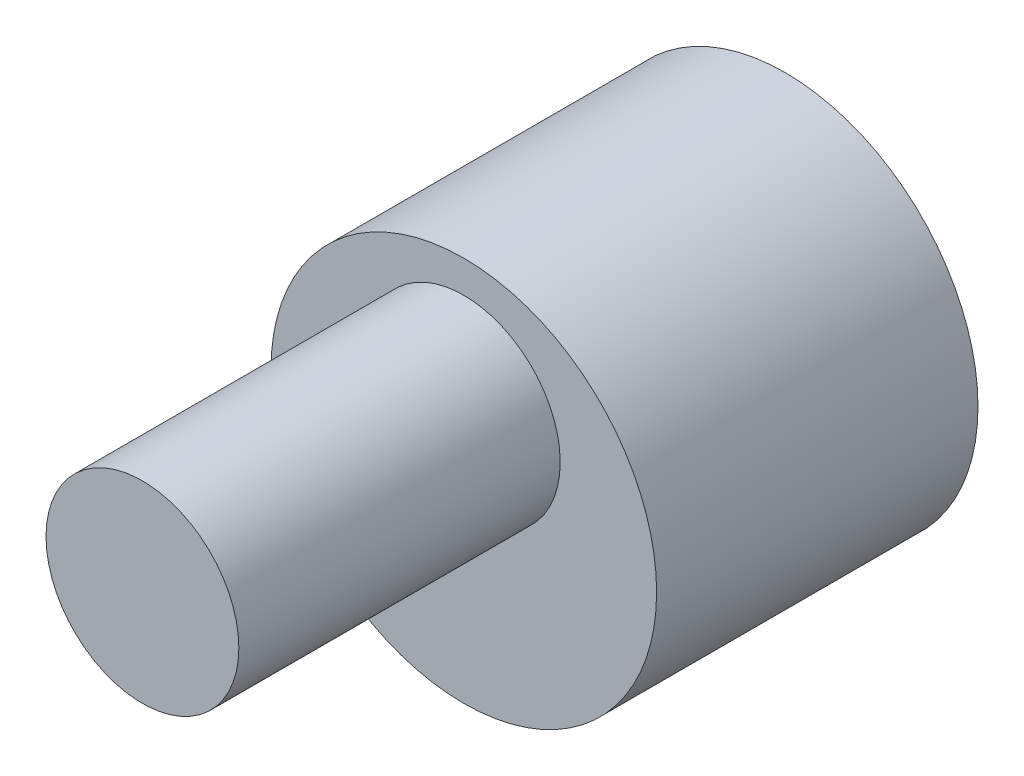
ISO-10303-21;
HEADER;
FILE_DESCRIPTION(('STEP AP214'),'2;1');
FILE_NAME('part.step','',(''),(''),'','','');
FILE_SCHEMA(('AUTOMOTIVE_DESIGN { 1 0 10303 214 1 1 1 1 }'));
ENDSEC;
DATA;
#1=APPLICATION_CONTEXT('core data for automotive mechanical design processes');
#2=APPLICATION_PROTOCOL_DEFINITION('international standard','automotive_design',2000,#1);
#3=PRODUCT_CONTEXT('',#1,'mechanical');
#4=PRODUCT('Part','Part','',(#3));
#5=PRODUCT_RELATED_PRODUCT_CATEGORY('part','',(#4));
#6=PRODUCT_DEFINITION_FORMATION('','',#4);
#7=PRODUCT_DEFINITION_CONTEXT('part definition',#1,'design');
#8=PRODUCT_DEFINITION('design','',#6,#7);
#9=PRODUCT_DEFINITION_SHAPE('','',#8);
#10=(LENGTH_UNIT() NAMED_UNIT(*) SI_UNIT(.MILLI.,.METRE.));
#11=(NAMED_UNIT(*) PLANE_ANGLE_UNIT() SI_UNIT($,.RADIAN.));
#12=(NAMED_UNIT(*) SI_UNIT($,.STERADIAN.) SOLID_ANGLE_UNIT());
#13=UNCERTAINTY_MEASURE_WITH_UNIT(LENGTH_MEASURE(1.E-05),#10,'distance_accuracy_value','');
#14=(GEOMETRIC_REPRESENTATION_CONTEXT(3) GLOBAL_UNCERTAINTY_ASSIGNED_CONTEXT((#13)) GLOBAL_UNIT_ASSIGNED_CONTEXT((#10,
#11,#12)) REPRESENTATION_CONTEXT('',''));
#15=CARTESIAN_POINT('',(0.,0.,0.));
#16=DIRECTION('',(0.,0.,1.));
#17=DIRECTION('',(1.,0.,0.));
#18=AXIS2_PLACEMENT_3D('',#15,#16,#17);
#19=CARTESIAN_POINT('',(0.,0.,10.));
#20=DIRECTION('',(0.,0.,-1.));
#21=DIRECTION('',(-1.,0.,0.));
#22=AXIS2_PLACEMENT_3D('',#19,#20,#21);
#23=CYLINDRICAL_SURFACE('',#22,6.);
#24=CARTESIAN_POINT('',(0.,0.,10.));
#25=DIRECTION('',(0.,0.,1.));
#26=DIRECTION('',(1.,0.,0.));
#27=AXIS2_PLACEMENT_3D('',#24,#25,#26);
#28=CIRCLE('',#27,6.);
#29=CARTESIAN_POINT('',(6.,0.,10.));
#30=VERTEX_POINT('',#29);
#31=EDGE_CURVE('E10',#30,#30,#28,.T.);
#32=ORIENTED_EDGE('',*,*,#31,.F.);
#33=EDGE_LOOP('',(#32));
#34=FACE_BOUND('',#33,.T.);
#35=CARTESIAN_POINT('',(0.,0.,0.));
#36=DIRECTION('',(0.,0.,1.));
#37=DIRECTION('',(1.,0.,0.));
#38=AXIS2_PLACEMENT_3D('',#35,#36,#37);
#39=CIRCLE('',#38,6.);
#40=CARTESIAN_POINT('',(6.,0.,0.));
#41=VERTEX_POINT('',#40);
#42=EDGE_CURVE('E34',#41,#41,#39,.T.);
#43=ORIENTED_EDGE('',*,*,#42,.T.);
#44=EDGE_LOOP('',(#43));
#45=FACE_BOUND('',#44,.T.);
#46=ADVANCED_FACE('F31',(#34,#45),#23,.T.);
#47=CARTESIAN_POINT('',(0.,0.,10.));
#48=DIRECTION('',(0.,0.,1.));
#49=DIRECTION('',(1.,0.,0.));
#50=AXIS2_PLACEMENT_3D('',#47,#48,#49);
#51=PLANE('',#50);
#52=CARTESIAN_POINT('',(0.,2.,10.));
#53=DIRECTION('',(0.,0.,1.));
#54=DIRECTION('',(1.,0.,0.));
#55=AXIS2_PLACEMENT_3D('',#52,#53,#54);
#56=CIRCLE('',#55,3.);
#57=CARTESIAN_POINT('',(3.,2.,10.));
#58=VERTEX_POINT('',#57);
#59=EDGE_CURVE('E43',#58,#58,#56,.T.);
#60=ORIENTED_EDGE('',*,*,#59,.F.);
#61=EDGE_LOOP('',(#60));
#62=FACE_BOUND('',#61,.T.);
#63=ORIENTED_EDGE('',*,*,#31,.T.);
#64=EDGE_LOOP('',(#63));
#65=FACE_BOUND('',#64,.T.);
#66=ADVANCED_FACE('F58',(#62,#65),#51,.T.);
#67=CARTESIAN_POINT('',(0.,0.,0.));
#68=DIRECTION('',(0.,0.,1.));
#69=DIRECTION('',(1.,0.,0.));
#70=AXIS2_PLACEMENT_3D('',#67,#68,#69);
#71=PLANE('',#70);
#72=ORIENTED_EDGE('',*,*,#42,.F.);
#73=EDGE_LOOP('',(#72));
#74=FACE_BOUND('',#73,.T.);
#75=ADVANCED_FACE('F54',(#74),#71,.F.);
#76=CARTESIAN_POINT('',(0.,2.,20.));
#77=DIRECTION('',(0.,0.,-1.));
#78=DIRECTION('',(-1.,0.,0.));
#79=AXIS2_PLACEMENT_3D('',#76,#77,#78);
#80=CYLINDRICAL_SURFACE('',#79,3.);
#81=CARTESIAN_POINT('',(0.,2.,20.));
#82=DIRECTION('',(0.,0.,1.));
#83=DIRECTION('',(1.,0.,0.));
#84=AXIS2_PLACEMENT_3D('',#81,#82,#83);
#85=CIRCLE('',#84,3.);
#86=CARTESIAN_POINT('',(3.,2.,20.));
#87=VERTEX_POINT('',#86);
#88=EDGE_CURVE('E41',#87,#87,#85,.T.);
#89=ORIENTED_EDGE('',*,*,#88,.F.);
#90=EDGE_LOOP('',(#89));
#91=FACE_BOUND('',#90,.T.);
#92=ORIENTED_EDGE('',*,*,#59,.T.);
#93=EDGE_LOOP('',(#92));
#94=FACE_BOUND('',#93,.T.);
#95=ADVANCED_FACE('F51',(#91,#94),#80,.T.);
#96=CARTESIAN_POINT('',(0.,2.,20.));
#97=DIRECTION('',(0.,0.,1.));
#98=DIRECTION('',(1.,0.,0.));
#99=AXIS2_PLACEMENT_3D('',#96,#97,#98);
#100=PLANE('',#99);
#101=ORIENTED_EDGE('',*,*,#88,.T.);
#102=EDGE_LOOP('',(#101));
#103=FACE_BOUND('',#102,.T.);
#104=ADVANCED_FACE('F49',(#103),#100,.T.);
#105=CLOSED_SHELL('',(#46,#66,#75,#95,#104));
#106=MANIFOLD_SOLID_BREP('B2',#105);
#107=ADVANCED_BREP_SHAPE_REPRESENTATION('',(#18,#106),#14);
#108=SHAPE_DEFINITION_REPRESENTATION(#9,#107);
ENDSEC;
END-ISO-10303-21;
